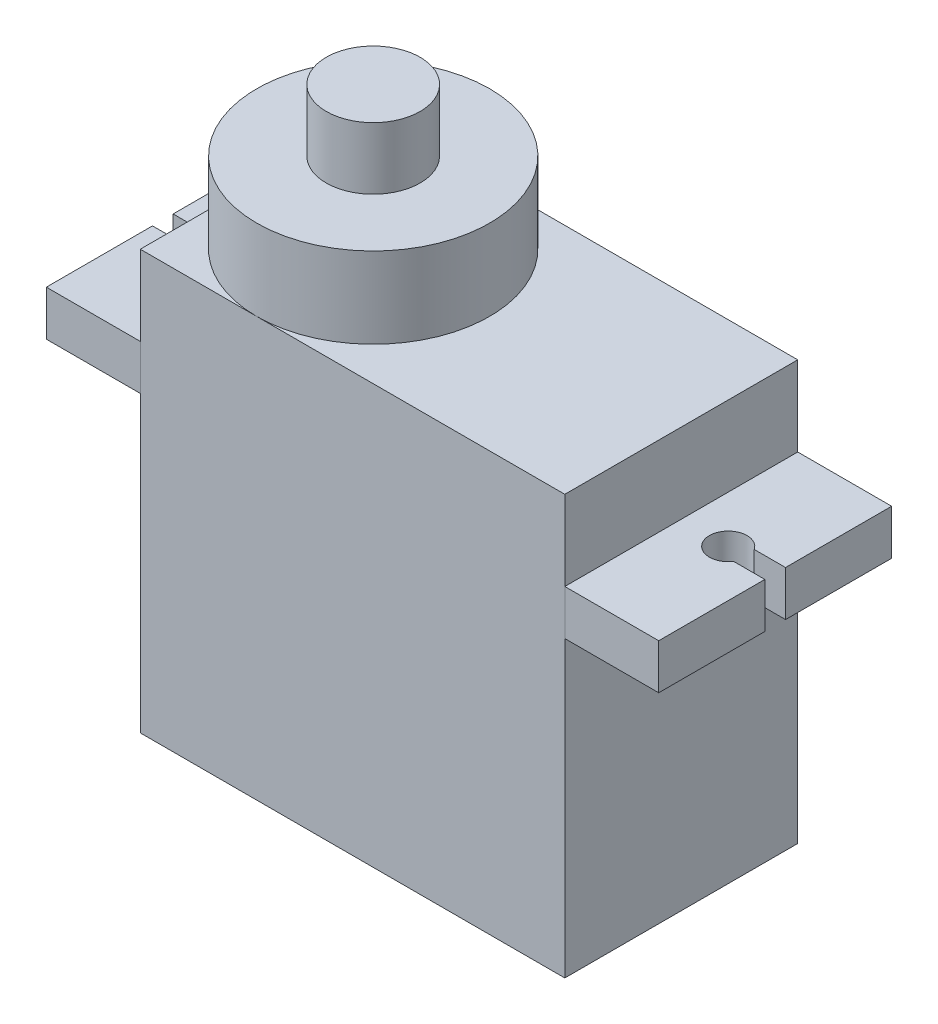
ISO-10303-21;
HEADER;
FILE_DESCRIPTION(('STEP AP214'),'2;1');
FILE_NAME('part.step','',(''),(''),'','','');
FILE_SCHEMA(('AUTOMOTIVE_DESIGN { 1 0 10303 214 1 1 1 1 }'));
ENDSEC;
DATA;
#1=APPLICATION_CONTEXT('core data for automotive mechanical design processes');
#2=APPLICATION_PROTOCOL_DEFINITION('international standard','automotive_design',2000,#1);
#3=PRODUCT_CONTEXT('',#1,'mechanical');
#4=PRODUCT('Part','Part','',(#3));
#5=PRODUCT_RELATED_PRODUCT_CATEGORY('part','',(#4));
#6=PRODUCT_DEFINITION_FORMATION('','',#4);
#7=PRODUCT_DEFINITION_CONTEXT('part definition',#1,'design');
#8=PRODUCT_DEFINITION('design','',#6,#7);
#9=PRODUCT_DEFINITION_SHAPE('','',#8);
#10=(LENGTH_UNIT() NAMED_UNIT(*) SI_UNIT(.MILLI.,.METRE.));
#11=(NAMED_UNIT(*) PLANE_ANGLE_UNIT() SI_UNIT($,.RADIAN.));
#12=(NAMED_UNIT(*) SI_UNIT($,.STERADIAN.) SOLID_ANGLE_UNIT());
#13=UNCERTAINTY_MEASURE_WITH_UNIT(LENGTH_MEASURE(1.E-05),#10,'distance_accuracy_value','');
#14=(GEOMETRIC_REPRESENTATION_CONTEXT(3) GLOBAL_UNCERTAINTY_ASSIGNED_CONTEXT((#13)) GLOBAL_UNIT_ASSIGNED_CONTEXT((#10,
#11,#12)) REPRESENTATION_CONTEXT('',''));
#15=CARTESIAN_POINT('',(0.,0.,0.));
#16=DIRECTION('',(0.,0.,1.));
#17=DIRECTION('',(1.,0.,0.));
#18=AXIS2_PLACEMENT_3D('',#15,#16,#17);
#19=CARTESIAN_POINT('',(-16.3,18.05,-6.2));
#20=DIRECTION('',(-1.,0.,0.));
#21=DIRECTION('',(0.,0.,1.));
#22=AXIS2_PLACEMENT_3D('',#19,#20,#21);
#23=PLANE('',#22);
#24=DIRECTION('',(0.,1.,0.));
#25=VECTOR('',#24,1.);
#26=CARTESIAN_POINT('',(-16.3,0.,0.550000000000012));
#27=LINE('',#26,#25);
#28=CARTESIAN_POINT('',(-16.3,15.65,0.550000000000012));
#29=VERTEX_POINT('',#28);
#30=CARTESIAN_POINT('',(-16.3,18.05,0.550000000000012));
#31=VERTEX_POINT('',#30);
#32=EDGE_CURVE('E149',#29,#31,#27,.T.);
#33=ORIENTED_EDGE('',*,*,#32,.F.);
#34=DIRECTION('',(0.,0.,1.));
#35=VECTOR('',#34,1.);
#36=CARTESIAN_POINT('',(-16.3,15.65,-6.2));
#37=LINE('',#36,#35);
#38=CARTESIAN_POINT('',(-16.3,15.65,6.2));
#39=VERTEX_POINT('',#38);
#40=EDGE_CURVE('E154',#29,#39,#37,.T.);
#41=ORIENTED_EDGE('',*,*,#40,.T.);
#42=DIRECTION('',(0.,-1.,0.));
#43=VECTOR('',#42,1.);
#44=CARTESIAN_POINT('',(-16.3,18.05,6.2));
#45=LINE('',#44,#43);
#46=CARTESIAN_POINT('',(-16.3,18.05,6.2));
#47=VERTEX_POINT('',#46);
#48=EDGE_CURVE('E162',#47,#39,#45,.T.);
#49=ORIENTED_EDGE('',*,*,#48,.F.);
#50=DIRECTION('',(0.,0.,1.));
#51=VECTOR('',#50,1.);
#52=CARTESIAN_POINT('',(-16.3,18.05,-6.2));
#53=LINE('',#52,#51);
#54=EDGE_CURVE('E155',#31,#47,#53,.T.);
#55=ORIENTED_EDGE('',*,*,#54,.F.);
#56=EDGE_LOOP('',(#33,#41,#49,#55));
#57=FACE_BOUND('',#56,.T.);
#58=ADVANCED_FACE('F61',(#57),#23,.T.);
#59=CARTESIAN_POINT('',(-11.3,18.05,-6.2));
#60=DIRECTION('',(1.,0.,0.));
#61=DIRECTION('',(0.,0.,-1.));
#62=AXIS2_PLACEMENT_3D('',#59,#60,#61);
#63=PLANE('',#62);
#64=DIRECTION('',(0.,1.,0.));
#65=VECTOR('',#64,1.);
#66=CARTESIAN_POINT('',(-11.3,18.05,6.2));
#67=LINE('',#66,#65);
#68=CARTESIAN_POINT('',(-11.3,15.65,6.2));
#69=VERTEX_POINT('',#68);
#70=CARTESIAN_POINT('',(-11.3,18.05,6.2));
#71=VERTEX_POINT('',#70);
#72=EDGE_CURVE('E168',#69,#71,#67,.T.);
#73=ORIENTED_EDGE('',*,*,#72,.F.);
#74=DIRECTION('',(0.,0.,1.));
#75=VECTOR('',#74,1.);
#76=CARTESIAN_POINT('',(-11.3,15.65,-6.2));
#77=LINE('',#76,#75);
#78=CARTESIAN_POINT('',(-11.3,15.65,-6.2));
#79=VERTEX_POINT('',#78);
#80=EDGE_CURVE('E12',#79,#69,#77,.T.);
#81=ORIENTED_EDGE('',*,*,#80,.F.);
#82=DIRECTION('',(0.,1.,0.));
#83=VECTOR('',#82,1.);
#84=CARTESIAN_POINT('',(-11.3,18.05,-6.2));
#85=LINE('',#84,#83);
#86=CARTESIAN_POINT('',(-11.3,18.05,-6.2));
#87=VERTEX_POINT('',#86);
#88=EDGE_CURVE('E161',#79,#87,#85,.T.);
#89=ORIENTED_EDGE('',*,*,#88,.T.);
#90=DIRECTION('',(0.,0.,1.));
#91=VECTOR('',#90,1.);
#92=CARTESIAN_POINT('',(-11.3,18.05,-6.2));
#93=LINE('',#92,#91);
#94=EDGE_CURVE('E65',#87,#71,#93,.T.);
#95=ORIENTED_EDGE('',*,*,#94,.T.);
#96=EDGE_LOOP('',(#73,#81,#89,#95));
#97=FACE_BOUND('',#96,.T.);
#98=ADVANCED_FACE('F63',(#97),#63,.T.);
#99=CARTESIAN_POINT('',(-11.3,15.65,-6.2));
#100=DIRECTION('',(0.,-1.,0.));
#101=DIRECTION('',(0.,0.,-1.));
#102=AXIS2_PLACEMENT_3D('',#99,#100,#101);
#103=PLANE('',#102);
#104=DIRECTION('',(-1.,0.,0.));
#105=VECTOR('',#104,1.);
#106=CARTESIAN_POINT('',(-11.3,15.65,0.55000000000001));
#107=LINE('',#106,#105);
#108=CARTESIAN_POINT('',(-14.6351646544245,15.65,0.550000000000011));
#109=VERTEX_POINT('',#108);
#110=EDGE_CURVE('E179',#109,#29,#107,.T.);
#111=ORIENTED_EDGE('',*,*,#110,.F.);
#112=CARTESIAN_POINT('',(-13.8,15.65,0.));
#113=DIRECTION('',(0.,-1.,0.));
#114=DIRECTION('',(0.,0.,-1.));
#115=AXIS2_PLACEMENT_3D('',#112,#113,#114);
#116=CIRCLE('',#115,1.);
#117=CARTESIAN_POINT('',(-14.6351646544245,15.65,-0.550000000000004));
#118=VERTEX_POINT('',#117);
#119=EDGE_CURVE('E171',#118,#109,#116,.T.);
#120=ORIENTED_EDGE('',*,*,#119,.F.);
#121=DIRECTION('',(1.,0.,0.));
#122=VECTOR('',#121,1.);
#123=CARTESIAN_POINT('',(-11.3,15.65,-0.550000000000004));
#124=LINE('',#123,#122);
#125=CARTESIAN_POINT('',(-16.3,15.65,-0.550000000000004));
#126=VERTEX_POINT('',#125);
#127=EDGE_CURVE('E181',#126,#118,#124,.T.);
#128=ORIENTED_EDGE('',*,*,#127,.F.);
#129=CARTESIAN_POINT('',(-16.3,15.65,-6.2));
#130=VERTEX_POINT('',#129);
#131=EDGE_CURVE('E70',#130,#126,#37,.T.);
#132=ORIENTED_EDGE('',*,*,#131,.F.);
#133=DIRECTION('',(1.,0.,0.));
#134=VECTOR('',#133,1.);
#135=CARTESIAN_POINT('',(-11.3,15.65,-6.2));
#136=LINE('',#135,#134);
#137=EDGE_CURVE('E172',#130,#79,#136,.T.);
#138=ORIENTED_EDGE('',*,*,#137,.T.);
#139=ORIENTED_EDGE('',*,*,#80,.T.);
#140=DIRECTION('',(1.,0.,0.));
#141=VECTOR('',#140,1.);
#142=CARTESIAN_POINT('',(-11.3,15.65,6.2));
#143=LINE('',#142,#141);
#144=EDGE_CURVE('E158',#39,#69,#143,.T.);
#145=ORIENTED_EDGE('',*,*,#144,.F.);
#146=ORIENTED_EDGE('',*,*,#40,.F.);
#147=EDGE_LOOP('',(#111,#120,#128,#132,#138,#139,#145,#146));
#148=FACE_BOUND('',#147,.T.);
#149=ADVANCED_FACE('F203',(#148),#103,.T.);
#150=DIRECTION('',(0.,1.,0.));
#151=VECTOR('',#150,1.);
#152=CARTESIAN_POINT('',(-16.3,0.,-0.550000000000004));
#153=LINE('',#152,#151);
#154=CARTESIAN_POINT('',(-16.3,18.05,-0.550000000000004));
#155=VERTEX_POINT('',#154);
#156=EDGE_CURVE('E137',#126,#155,#153,.T.);
#157=ORIENTED_EDGE('',*,*,#156,.T.);
#158=CARTESIAN_POINT('',(-16.3,18.05,-6.2));
#159=VERTEX_POINT('',#158);
#160=EDGE_CURVE('E147',#159,#155,#53,.T.);
#161=ORIENTED_EDGE('',*,*,#160,.F.);
#162=DIRECTION('',(0.,-1.,0.));
#163=VECTOR('',#162,1.);
#164=CARTESIAN_POINT('',(-16.3,18.05,-6.2));
#165=LINE('',#164,#163);
#166=EDGE_CURVE('E174',#159,#130,#165,.T.);
#167=ORIENTED_EDGE('',*,*,#166,.T.);
#168=ORIENTED_EDGE('',*,*,#131,.T.);
#169=EDGE_LOOP('',(#157,#161,#167,#168));
#170=FACE_BOUND('',#169,.T.);
#171=ADVANCED_FACE('F145',(#170),#23,.T.);
#172=CARTESIAN_POINT('',(-11.3,18.05,-6.2));
#173=DIRECTION('',(0.,1.,0.));
#174=DIRECTION('',(0.,0.,1.));
#175=AXIS2_PLACEMENT_3D('',#172,#173,#174);
#176=PLANE('',#175);
#177=DIRECTION('',(1.,0.,0.));
#178=VECTOR('',#177,1.);
#179=CARTESIAN_POINT('',(-14.6351646544245,18.05,0.550000000000011));
#180=LINE('',#179,#178);
#181=CARTESIAN_POINT('',(-14.6351646544245,18.05,0.550000000000011));
#182=VERTEX_POINT('',#181);
#183=EDGE_CURVE('E141',#31,#182,#180,.T.);
#184=ORIENTED_EDGE('',*,*,#183,.F.);
#185=ORIENTED_EDGE('',*,*,#54,.T.);
#186=DIRECTION('',(-1.,0.,0.));
#187=VECTOR('',#186,1.);
#188=CARTESIAN_POINT('',(-11.3,18.05,6.2));
#189=LINE('',#188,#187);
#190=EDGE_CURVE('E165',#71,#47,#189,.T.);
#191=ORIENTED_EDGE('',*,*,#190,.F.);
#192=ORIENTED_EDGE('',*,*,#94,.F.);
#193=DIRECTION('',(-1.,0.,0.));
#194=VECTOR('',#193,1.);
#195=CARTESIAN_POINT('',(-11.3,18.05,-6.2));
#196=LINE('',#195,#194);
#197=EDGE_CURVE('E153',#87,#159,#196,.T.);
#198=ORIENTED_EDGE('',*,*,#197,.T.);
#199=ORIENTED_EDGE('',*,*,#160,.T.);
#200=DIRECTION('',(-1.,0.,0.));
#201=VECTOR('',#200,1.);
#202=CARTESIAN_POINT('',(-16.3,18.05,-0.550000000000004));
#203=LINE('',#202,#201);
#204=CARTESIAN_POINT('',(-14.6351646544245,18.05,-0.550000000000004));
#205=VERTEX_POINT('',#204);
#206=EDGE_CURVE('E134',#205,#155,#203,.T.);
#207=ORIENTED_EDGE('',*,*,#206,.F.);
#208=CARTESIAN_POINT('',(-13.8,18.05,0.));
#209=DIRECTION('',(0.,1.,0.));
#210=DIRECTION('',(0.,0.,-1.));
#211=AXIS2_PLACEMENT_3D('',#208,#209,#210);
#212=CIRCLE('',#211,1.);
#213=EDGE_CURVE('E78',#182,#205,#212,.T.);
#214=ORIENTED_EDGE('',*,*,#213,.F.);
#215=EDGE_LOOP('',(#184,#185,#191,#192,#198,#199,#207,#214));
#216=FACE_BOUND('',#215,.T.);
#217=ADVANCED_FACE('F152',(#216),#176,.T.);
#218=CARTESIAN_POINT('',(0.,0.,-6.2));
#219=DIRECTION('',(0.,0.,-1.));
#220=DIRECTION('',(-1.,0.,0.));
#221=AXIS2_PLACEMENT_3D('',#218,#219,#220);
#222=PLANE('',#221);
#223=ORIENTED_EDGE('',*,*,#88,.F.);
#224=ORIENTED_EDGE('',*,*,#137,.F.);
#225=ORIENTED_EDGE('',*,*,#166,.F.);
#226=ORIENTED_EDGE('',*,*,#197,.F.);
#227=EDGE_LOOP('',(#223,#224,#225,#226));
#228=FACE_BOUND('',#227,.T.);
#229=ADVANCED_FACE('F202',(#228),#222,.T.);
#230=CARTESIAN_POINT('',(0.,0.,6.2));
#231=DIRECTION('',(0.,0.,-1.));
#232=DIRECTION('',(-1.,0.,0.));
#233=AXIS2_PLACEMENT_3D('',#230,#231,#232);
#234=PLANE('',#233);
#235=ORIENTED_EDGE('',*,*,#72,.T.);
#236=ORIENTED_EDGE('',*,*,#190,.T.);
#237=ORIENTED_EDGE('',*,*,#48,.T.);
#238=ORIENTED_EDGE('',*,*,#144,.T.);
#239=EDGE_LOOP('',(#235,#236,#237,#238));
#240=FACE_BOUND('',#239,.T.);
#241=ADVANCED_FACE('F199',(#240),#234,.F.);
#242=CARTESIAN_POINT('',(-13.8,0.,0.));
#243=DIRECTION('',(0.,1.,0.));
#244=DIRECTION('',(0.,0.,1.));
#245=AXIS2_PLACEMENT_3D('',#242,#243,#244);
#246=CYLINDRICAL_SURFACE('',#245,1.);
#247=ORIENTED_EDGE('',*,*,#119,.T.);
#248=DIRECTION('',(0.,1.,0.));
#249=VECTOR('',#248,1.);
#250=CARTESIAN_POINT('',(-14.6351646544245,0.,0.550000000000011));
#251=LINE('',#250,#249);
#252=EDGE_CURVE('E183',#109,#182,#251,.T.);
#253=ORIENTED_EDGE('',*,*,#252,.T.);
#254=ORIENTED_EDGE('',*,*,#213,.T.);
#255=DIRECTION('',(0.,1.,0.));
#256=VECTOR('',#255,1.);
#257=CARTESIAN_POINT('',(-14.6351646544245,0.,-0.550000000000004));
#258=LINE('',#257,#256);
#259=EDGE_CURVE('E139',#118,#205,#258,.T.);
#260=ORIENTED_EDGE('',*,*,#259,.F.);
#261=EDGE_LOOP('',(#247,#253,#254,#260));
#262=FACE_BOUND('',#261,.T.);
#263=ADVANCED_FACE('F205',(#262),#246,.F.);
#264=CARTESIAN_POINT('',(-14.6351646544245,0.,0.550000000000011));
#265=DIRECTION('',(0.,0.,1.));
#266=DIRECTION('',(1.,0.,0.));
#267=AXIS2_PLACEMENT_3D('',#264,#265,#266);
#268=PLANE('',#267);
#269=ORIENTED_EDGE('',*,*,#110,.T.);
#270=ORIENTED_EDGE('',*,*,#32,.T.);
#271=ORIENTED_EDGE('',*,*,#183,.T.);
#272=ORIENTED_EDGE('',*,*,#252,.F.);
#273=EDGE_LOOP('',(#269,#270,#271,#272));
#274=FACE_BOUND('',#273,.T.);
#275=ADVANCED_FACE('F191',(#274),#268,.F.);
#276=CARTESIAN_POINT('',(-16.3,0.,-0.550000000000004));
#277=DIRECTION('',(0.,0.,-1.));
#278=DIRECTION('',(-1.,0.,0.));
#279=AXIS2_PLACEMENT_3D('',#276,#277,#278);
#280=PLANE('',#279);
#281=ORIENTED_EDGE('',*,*,#127,.T.);
#282=ORIENTED_EDGE('',*,*,#259,.T.);
#283=ORIENTED_EDGE('',*,*,#206,.T.);
#284=ORIENTED_EDGE('',*,*,#156,.F.);
#285=EDGE_LOOP('',(#281,#282,#283,#284));
#286=FACE_BOUND('',#285,.T.);
#287=ADVANCED_FACE('F136',(#286),#280,.F.);
#288=CLOSED_SHELL('',(#58,#98,#149,#171,#217,#229,#241,#263,#275,#287));
#289=MANIFOLD_SOLID_BREP('B2',#288);
#290=CARTESIAN_POINT('',(16.3,18.05,-6.2));
#291=DIRECTION('',(1.,0.,0.));
#292=DIRECTION('',(0.,0.,-1.));
#293=AXIS2_PLACEMENT_3D('',#290,#291,#292);
#294=PLANE('',#293);
#295=DIRECTION('',(0.,1.,0.));
#296=VECTOR('',#295,1.);
#297=CARTESIAN_POINT('',(16.3,0.,-0.550000000000004));
#298=LINE('',#297,#296);
#299=CARTESIAN_POINT('',(16.3,15.65,-0.550000000000004));
#300=VERTEX_POINT('',#299);
#301=CARTESIAN_POINT('',(16.3,18.05,-0.550000000000004));
#302=VERTEX_POINT('',#301);
#303=EDGE_CURVE('E391',#300,#302,#298,.T.);
#304=ORIENTED_EDGE('',*,*,#303,.F.);
#305=DIRECTION('',(0.,0.,1.));
#306=VECTOR('',#305,1.);
#307=CARTESIAN_POINT('',(16.3,15.65,-6.2));
#308=LINE('',#307,#306);
#309=CARTESIAN_POINT('',(16.3,15.65,-6.2));
#310=VERTEX_POINT('',#309);
#311=EDGE_CURVE('E418',#310,#300,#308,.T.);
#312=ORIENTED_EDGE('',*,*,#311,.F.);
#313=DIRECTION('',(0.,1.,0.));
#314=VECTOR('',#313,1.);
#315=CARTESIAN_POINT('',(16.3,18.05,-6.2));
#316=LINE('',#315,#314);
#317=CARTESIAN_POINT('',(16.3,18.05,-6.2));
#318=VERTEX_POINT('',#317);
#319=EDGE_CURVE('E399',#310,#318,#316,.T.);
#320=ORIENTED_EDGE('',*,*,#319,.T.);
#321=DIRECTION('',(0.,0.,1.));
#322=VECTOR('',#321,1.);
#323=CARTESIAN_POINT('',(16.3,18.05,-6.2));
#324=LINE('',#323,#322);
#325=EDGE_CURVE('E415',#318,#302,#324,.T.);
#326=ORIENTED_EDGE('',*,*,#325,.T.);
#327=EDGE_LOOP('',(#304,#312,#320,#326));
#328=FACE_BOUND('',#327,.T.);
#329=ADVANCED_FACE('F294',(#328),#294,.T.);
#330=CARTESIAN_POINT('',(11.3,18.05,-6.2));
#331=DIRECTION('',(-1.,0.,0.));
#332=DIRECTION('',(0.,0.,1.));
#333=AXIS2_PLACEMENT_3D('',#330,#331,#332);
#334=PLANE('',#333);
#335=DIRECTION('',(0.,-1.,0.));
#336=VECTOR('',#335,1.);
#337=CARTESIAN_POINT('',(11.3,18.05,6.2));
#338=LINE('',#337,#336);
#339=CARTESIAN_POINT('',(11.3,18.05,6.2));
#340=VERTEX_POINT('',#339);
#341=CARTESIAN_POINT('',(11.3,15.65,6.2));
#342=VERTEX_POINT('',#341);
#343=EDGE_CURVE('E390',#340,#342,#338,.T.);
#344=ORIENTED_EDGE('',*,*,#343,.F.);
#345=DIRECTION('',(0.,0.,1.));
#346=VECTOR('',#345,1.);
#347=CARTESIAN_POINT('',(11.3,18.05,-6.2));
#348=LINE('',#347,#346);
#349=CARTESIAN_POINT('',(11.3,18.05,-6.2));
#350=VERTEX_POINT('',#349);
#351=EDGE_CURVE('E318',#350,#340,#348,.T.);
#352=ORIENTED_EDGE('',*,*,#351,.F.);
#353=DIRECTION('',(0.,-1.,0.));
#354=VECTOR('',#353,1.);
#355=CARTESIAN_POINT('',(11.3,18.05,-6.2));
#356=LINE('',#355,#354);
#357=CARTESIAN_POINT('',(11.3,15.65,-6.2));
#358=VERTEX_POINT('',#357);
#359=EDGE_CURVE('E394',#350,#358,#356,.T.);
#360=ORIENTED_EDGE('',*,*,#359,.T.);
#361=DIRECTION('',(0.,0.,1.));
#362=VECTOR('',#361,1.);
#363=CARTESIAN_POINT('',(11.3,15.65,-6.2));
#364=LINE('',#363,#362);
#365=EDGE_CURVE('E344',#358,#342,#364,.T.);
#366=ORIENTED_EDGE('',*,*,#365,.T.);
#367=EDGE_LOOP('',(#344,#352,#360,#366));
#368=FACE_BOUND('',#367,.T.);
#369=ADVANCED_FACE('F296',(#368),#334,.T.);
#370=CARTESIAN_POINT('',(11.3,18.05,-6.2));
#371=DIRECTION('',(0.,1.,0.));
#372=DIRECTION('',(0.,0.,1.));
#373=AXIS2_PLACEMENT_3D('',#370,#371,#372);
#374=PLANE('',#373);
#375=DIRECTION('',(-1.,0.,0.));
#376=VECTOR('',#375,1.);
#377=CARTESIAN_POINT('',(14.6351646544245,18.05,-0.550000000000004));
#378=LINE('',#377,#376);
#379=CARTESIAN_POINT('',(14.6351646544245,18.05,-0.550000000000004));
#380=VERTEX_POINT('',#379);
#381=EDGE_CURVE('E373',#302,#380,#378,.T.);
#382=ORIENTED_EDGE('',*,*,#381,.F.);
#383=ORIENTED_EDGE('',*,*,#325,.F.);
#384=DIRECTION('',(-1.,0.,0.));
#385=VECTOR('',#384,1.);
#386=CARTESIAN_POINT('',(11.3,18.05,-6.2));
#387=LINE('',#386,#385);
#388=EDGE_CURVE('E402',#318,#350,#387,.T.);
#389=ORIENTED_EDGE('',*,*,#388,.T.);
#390=ORIENTED_EDGE('',*,*,#351,.T.);
#391=DIRECTION('',(-1.,0.,0.));
#392=VECTOR('',#391,1.);
#393=CARTESIAN_POINT('',(11.3,18.05,6.2));
#394=LINE('',#393,#392);
#395=CARTESIAN_POINT('',(16.3,18.05,6.2));
#396=VERTEX_POINT('',#395);
#397=EDGE_CURVE('E397',#396,#340,#394,.T.);
#398=ORIENTED_EDGE('',*,*,#397,.F.);
#399=CARTESIAN_POINT('',(16.3,18.05,0.549999999999996));
#400=VERTEX_POINT('',#399);
#401=EDGE_CURVE('E385',#400,#396,#324,.T.);
#402=ORIENTED_EDGE('',*,*,#401,.F.);
#403=DIRECTION('',(1.,0.,0.));
#404=VECTOR('',#403,1.);
#405=CARTESIAN_POINT('',(16.3,18.05,0.549999999999996));
#406=LINE('',#405,#404);
#407=CARTESIAN_POINT('',(14.6351646544245,18.05,0.549999999999997));
#408=VERTEX_POINT('',#407);
#409=EDGE_CURVE('E369',#408,#400,#406,.T.);
#410=ORIENTED_EDGE('',*,*,#409,.F.);
#411=CARTESIAN_POINT('',(13.8,18.05,0.));
#412=DIRECTION('',(0.,1.,0.));
#413=DIRECTION('',(0.,0.,1.));
#414=AXIS2_PLACEMENT_3D('',#411,#412,#413);
#415=CIRCLE('',#414,1.);
#416=EDGE_CURVE('E376',#380,#408,#415,.T.);
#417=ORIENTED_EDGE('',*,*,#416,.F.);
#418=EDGE_LOOP('',(#382,#383,#389,#390,#398,#402,#410,#417));
#419=FACE_BOUND('',#418,.T.);
#420=ADVANCED_FACE('F384',(#419),#374,.T.);
#421=DIRECTION('',(0.,1.,0.));
#422=VECTOR('',#421,1.);
#423=CARTESIAN_POINT('',(16.3,0.,0.549999999999996));
#424=LINE('',#423,#422);
#425=CARTESIAN_POINT('',(16.3,15.65,0.549999999999994));
#426=VERTEX_POINT('',#425);
#427=EDGE_CURVE('E309',#426,#400,#424,.T.);
#428=ORIENTED_EDGE('',*,*,#427,.T.);
#429=ORIENTED_EDGE('',*,*,#401,.T.);
#430=DIRECTION('',(0.,1.,0.));
#431=VECTOR('',#430,1.);
#432=CARTESIAN_POINT('',(16.3,18.05,6.2));
#433=LINE('',#432,#431);
#434=CARTESIAN_POINT('',(16.3,15.65,6.2));
#435=VERTEX_POINT('',#434);
#436=EDGE_CURVE('E409',#435,#396,#433,.T.);
#437=ORIENTED_EDGE('',*,*,#436,.F.);
#438=EDGE_CURVE('E421',#426,#435,#308,.T.);
#439=ORIENTED_EDGE('',*,*,#438,.F.);
#440=EDGE_LOOP('',(#428,#429,#437,#439));
#441=FACE_BOUND('',#440,.T.);
#442=ADVANCED_FACE('F438',(#441),#294,.T.);
#443=CARTESIAN_POINT('',(11.3,15.65,-6.2));
#444=DIRECTION('',(0.,-1.,0.));
#445=DIRECTION('',(0.,0.,-1.));
#446=AXIS2_PLACEMENT_3D('',#443,#444,#445);
#447=PLANE('',#446);
#448=DIRECTION('',(1.,0.,0.));
#449=VECTOR('',#448,1.);
#450=CARTESIAN_POINT('',(11.3,15.65,-0.550000000000004));
#451=LINE('',#450,#449);
#452=CARTESIAN_POINT('',(14.6351646544245,15.65,-0.550000000000004));
#453=VERTEX_POINT('',#452);
#454=EDGE_CURVE('E59',#453,#300,#451,.T.);
#455=ORIENTED_EDGE('',*,*,#454,.F.);
#456=CARTESIAN_POINT('',(13.8,15.65,0.));
#457=DIRECTION('',(0.,-1.,0.));
#458=DIRECTION('',(0.,0.,-1.));
#459=AXIS2_PLACEMENT_3D('',#456,#457,#458);
#460=CIRCLE('',#459,1.);
#461=CARTESIAN_POINT('',(14.6351646544245,15.65,0.549999999999997));
#462=VERTEX_POINT('',#461);
#463=EDGE_CURVE('E302',#462,#453,#460,.T.);
#464=ORIENTED_EDGE('',*,*,#463,.F.);
#465=DIRECTION('',(-1.,0.,0.));
#466=VECTOR('',#465,1.);
#467=CARTESIAN_POINT('',(11.3,15.65,0.549999999999998));
#468=LINE('',#467,#466);
#469=EDGE_CURVE('E370',#426,#462,#468,.T.);
#470=ORIENTED_EDGE('',*,*,#469,.F.);
#471=ORIENTED_EDGE('',*,*,#438,.T.);
#472=DIRECTION('',(1.,0.,0.));
#473=VECTOR('',#472,1.);
#474=CARTESIAN_POINT('',(11.3,15.65,6.2));
#475=LINE('',#474,#473);
#476=EDGE_CURVE('E406',#342,#435,#475,.T.);
#477=ORIENTED_EDGE('',*,*,#476,.F.);
#478=ORIENTED_EDGE('',*,*,#365,.F.);
#479=DIRECTION('',(1.,0.,0.));
#480=VECTOR('',#479,1.);
#481=CARTESIAN_POINT('',(11.3,15.65,-6.2));
#482=LINE('',#481,#480);
#483=EDGE_CURVE('E396',#358,#310,#482,.T.);
#484=ORIENTED_EDGE('',*,*,#483,.T.);
#485=ORIENTED_EDGE('',*,*,#311,.T.);
#486=EDGE_LOOP('',(#455,#464,#470,#471,#477,#478,#484,#485));
#487=FACE_BOUND('',#486,.T.);
#488=ADVANCED_FACE('F427',(#487),#447,.T.);
#489=CARTESIAN_POINT('',(0.,0.,-6.2));
#490=DIRECTION('',(0.,0.,1.));
#491=DIRECTION('',(1.,0.,0.));
#492=AXIS2_PLACEMENT_3D('',#489,#490,#491);
#493=PLANE('',#492);
#494=ORIENTED_EDGE('',*,*,#359,.F.);
#495=ORIENTED_EDGE('',*,*,#388,.F.);
#496=ORIENTED_EDGE('',*,*,#319,.F.);
#497=ORIENTED_EDGE('',*,*,#483,.F.);
#498=EDGE_LOOP('',(#494,#495,#496,#497));
#499=FACE_BOUND('',#498,.T.);
#500=ADVANCED_FACE('F432',(#499),#493,.F.);
#501=CARTESIAN_POINT('',(0.,0.,6.2));
#502=DIRECTION('',(0.,0.,1.));
#503=DIRECTION('',(1.,0.,0.));
#504=AXIS2_PLACEMENT_3D('',#501,#502,#503);
#505=PLANE('',#504);
#506=ORIENTED_EDGE('',*,*,#343,.T.);
#507=ORIENTED_EDGE('',*,*,#476,.T.);
#508=ORIENTED_EDGE('',*,*,#436,.T.);
#509=ORIENTED_EDGE('',*,*,#397,.T.);
#510=EDGE_LOOP('',(#506,#507,#508,#509));
#511=FACE_BOUND('',#510,.T.);
#512=ADVANCED_FACE('F436',(#511),#505,.T.);
#513=CARTESIAN_POINT('',(13.8,0.,0.));
#514=DIRECTION('',(0.,1.,0.));
#515=DIRECTION('',(0.,0.,1.));
#516=AXIS2_PLACEMENT_3D('',#513,#514,#515);
#517=CYLINDRICAL_SURFACE('',#516,1.);
#518=ORIENTED_EDGE('',*,*,#463,.T.);
#519=DIRECTION('',(0.,1.,0.));
#520=VECTOR('',#519,1.);
#521=CARTESIAN_POINT('',(14.6351646544245,0.,-0.550000000000004));
#522=LINE('',#521,#520);
#523=EDGE_CURVE('E379',#453,#380,#522,.T.);
#524=ORIENTED_EDGE('',*,*,#523,.T.);
#525=ORIENTED_EDGE('',*,*,#416,.T.);
#526=DIRECTION('',(0.,1.,0.));
#527=VECTOR('',#526,1.);
#528=CARTESIAN_POINT('',(14.6351646544245,0.,0.549999999999997));
#529=LINE('',#528,#527);
#530=EDGE_CURVE('E365',#462,#408,#529,.T.);
#531=ORIENTED_EDGE('',*,*,#530,.F.);
#532=EDGE_LOOP('',(#518,#524,#525,#531));
#533=FACE_BOUND('',#532,.T.);
#534=ADVANCED_FACE('F377',(#533),#517,.F.);
#535=CARTESIAN_POINT('',(14.6351646544245,0.,-0.550000000000004));
#536=DIRECTION('',(0.,0.,-1.));
#537=DIRECTION('',(-1.,0.,0.));
#538=AXIS2_PLACEMENT_3D('',#535,#536,#537);
#539=PLANE('',#538);
#540=ORIENTED_EDGE('',*,*,#454,.T.);
#541=ORIENTED_EDGE('',*,*,#303,.T.);
#542=ORIENTED_EDGE('',*,*,#381,.T.);
#543=ORIENTED_EDGE('',*,*,#523,.F.);
#544=EDGE_LOOP('',(#540,#541,#542,#543));
#545=FACE_BOUND('',#544,.T.);
#546=ADVANCED_FACE('F425',(#545),#539,.F.);
#547=CARTESIAN_POINT('',(16.3,0.,0.549999999999996));
#548=DIRECTION('',(0.,0.,1.));
#549=DIRECTION('',(1.,0.,0.));
#550=AXIS2_PLACEMENT_3D('',#547,#548,#549);
#551=PLANE('',#550);
#552=ORIENTED_EDGE('',*,*,#469,.T.);
#553=ORIENTED_EDGE('',*,*,#530,.T.);
#554=ORIENTED_EDGE('',*,*,#409,.T.);
#555=ORIENTED_EDGE('',*,*,#427,.F.);
#556=EDGE_LOOP('',(#552,#553,#554,#555));
#557=FACE_BOUND('',#556,.T.);
#558=ADVANCED_FACE('F367',(#557),#551,.F.);
#559=CLOSED_SHELL('',(#329,#369,#420,#442,#488,#500,#512,#534,#546,#558));
#560=MANIFOLD_SOLID_BREP('B6',#559);
#561=CARTESIAN_POINT('',(0.,22.3,0.));
#562=DIRECTION('',(0.,1.,0.));
#563=DIRECTION('',(0.,0.,1.));
#564=AXIS2_PLACEMENT_3D('',#561,#562,#563);
#565=PLANE('',#564);
#566=CARTESIAN_POINT('',(-5.1,22.3,0.));
#567=DIRECTION('',(0.,1.,0.));
#568=DIRECTION('',(0.,0.,1.));
#569=AXIS2_PLACEMENT_3D('',#566,#567,#568);
#570=CIRCLE('',#569,6.2);
#571=CARTESIAN_POINT('',(-5.1,22.3,6.2));
#572=VERTEX_POINT('',#571);
#573=CARTESIAN_POINT('',(-5.1,22.3,-6.2));
#574=VERTEX_POINT('',#573);
#575=EDGE_CURVE('E591',#572,#574,#570,.T.);
#576=ORIENTED_EDGE('',*,*,#575,.F.);
#577=DIRECTION('',(1.,0.,0.));
#578=VECTOR('',#577,1.);
#579=CARTESIAN_POINT('',(-11.3,22.3,6.2));
#580=LINE('',#579,#578);
#581=CARTESIAN_POINT('',(11.3,22.3,6.2));
#582=VERTEX_POINT('',#581);
#583=EDGE_CURVE('E578',#572,#582,#580,.T.);
#584=ORIENTED_EDGE('',*,*,#583,.T.);
#585=DIRECTION('',(0.,0.,-1.));
#586=VECTOR('',#585,1.);
#587=CARTESIAN_POINT('',(11.3,22.3,-6.2));
#588=LINE('',#587,#586);
#589=CARTESIAN_POINT('',(11.3,22.3,-6.2));
#590=VERTEX_POINT('',#589);
#591=EDGE_CURVE('E606',#582,#590,#588,.T.);
#592=ORIENTED_EDGE('',*,*,#591,.T.);
#593=DIRECTION('',(-1.,0.,0.));
#594=VECTOR('',#593,1.);
#595=CARTESIAN_POINT('',(-11.3,22.3,-6.2));
#596=LINE('',#595,#594);
#597=EDGE_CURVE('E592',#590,#574,#596,.T.);
#598=ORIENTED_EDGE('',*,*,#597,.T.);
#599=EDGE_LOOP('',(#576,#584,#592,#598));
#600=FACE_BOUND('',#599,.T.);
#601=ADVANCED_FACE('F518',(#600),#565,.T.);
#602=CARTESIAN_POINT('',(-11.3,22.3,0.));
#603=VERTEX_POINT('',#602);
#604=EDGE_CURVE('E528',#574,#603,#570,.T.);
#605=ORIENTED_EDGE('',*,*,#604,.F.);
#606=CARTESIAN_POINT('',(-11.3,22.3,-6.2));
#607=VERTEX_POINT('',#606);
#608=EDGE_CURVE('E609',#574,#607,#596,.T.);
#609=ORIENTED_EDGE('',*,*,#608,.T.);
#610=DIRECTION('',(0.,0.,1.));
#611=VECTOR('',#610,1.);
#612=CARTESIAN_POINT('',(-11.3,22.3,-6.2));
#613=LINE('',#612,#611);
#614=EDGE_CURVE('E588',#607,#603,#613,.T.);
#615=ORIENTED_EDGE('',*,*,#614,.T.);
#616=EDGE_LOOP('',(#605,#609,#615));
#617=FACE_BOUND('',#616,.T.);
#618=ADVANCED_FACE('F678',(#617),#565,.T.);
#619=CARTESIAN_POINT('',(11.3,22.3,-6.2));
#620=DIRECTION('',(-1.,0.,0.));
#621=DIRECTION('',(0.,0.,1.));
#622=AXIS2_PLACEMENT_3D('',#619,#620,#621);
#623=PLANE('',#622);
#624=DIRECTION('',(0.,0.,-1.));
#625=VECTOR('',#624,1.);
#626=CARTESIAN_POINT('',(11.3,0.,-6.2));
#627=LINE('',#626,#625);
#628=CARTESIAN_POINT('',(11.3,0.,6.2));
#629=VERTEX_POINT('',#628);
#630=CARTESIAN_POINT('',(11.3,0.,-6.2));
#631=VERTEX_POINT('',#630);
#632=EDGE_CURVE('E615',#629,#631,#627,.T.);
#633=ORIENTED_EDGE('',*,*,#632,.T.);
#634=DIRECTION('',(0.,-1.,0.));
#635=VECTOR('',#634,1.);
#636=CARTESIAN_POINT('',(11.3,22.3,-6.2));
#637=LINE('',#636,#635);
#638=EDGE_CURVE('E522',#590,#631,#637,.T.);
#639=ORIENTED_EDGE('',*,*,#638,.F.);
#640=ORIENTED_EDGE('',*,*,#591,.F.);
#641=DIRECTION('',(0.,-1.,0.));
#642=VECTOR('',#641,1.);
#643=CARTESIAN_POINT('',(11.3,22.3,6.2));
#644=LINE('',#643,#642);
#645=EDGE_CURVE('E577',#582,#629,#644,.T.);
#646=ORIENTED_EDGE('',*,*,#645,.T.);
#647=EDGE_LOOP('',(#633,#639,#640,#646));
#648=FACE_BOUND('',#647,.T.);
#649=ADVANCED_FACE('F520',(#648),#623,.F.);
#650=CARTESIAN_POINT('',(-11.3,22.3,-6.2));
#651=DIRECTION('',(0.,0.,1.));
#652=DIRECTION('',(1.,0.,0.));
#653=AXIS2_PLACEMENT_3D('',#650,#651,#652);
#654=PLANE('',#653);
#655=DIRECTION('',(-1.,0.,0.));
#656=VECTOR('',#655,1.);
#657=CARTESIAN_POINT('',(-11.3,0.,-6.2));
#658=LINE('',#657,#656);
#659=CARTESIAN_POINT('',(-11.3,0.,-6.2));
#660=VERTEX_POINT('',#659);
#661=EDGE_CURVE('E619',#631,#660,#658,.T.);
#662=ORIENTED_EDGE('',*,*,#661,.T.);
#663=DIRECTION('',(0.,-1.,0.));
#664=VECTOR('',#663,1.);
#665=CARTESIAN_POINT('',(-11.3,22.3,-6.2));
#666=LINE('',#665,#664);
#667=EDGE_CURVE('E603',#607,#660,#666,.T.);
#668=ORIENTED_EDGE('',*,*,#667,.F.);
#669=ORIENTED_EDGE('',*,*,#608,.F.);
#670=ORIENTED_EDGE('',*,*,#597,.F.);
#671=ORIENTED_EDGE('',*,*,#638,.T.);
#672=EDGE_LOOP('',(#662,#668,#669,#670,#671));
#673=FACE_BOUND('',#672,.T.);
#674=ADVANCED_FACE('F645',(#673),#654,.F.);
#675=CARTESIAN_POINT('',(-11.3,22.3,-6.2));
#676=DIRECTION('',(1.,0.,0.));
#677=DIRECTION('',(0.,0.,-1.));
#678=AXIS2_PLACEMENT_3D('',#675,#676,#677);
#679=PLANE('',#678);
#680=DIRECTION('',(0.,0.,1.));
#681=VECTOR('',#680,1.);
#682=CARTESIAN_POINT('',(-11.3,0.,-6.2));
#683=LINE('',#682,#681);
#684=CARTESIAN_POINT('',(-11.3,0.,6.2));
#685=VERTEX_POINT('',#684);
#686=EDGE_CURVE('E622',#660,#685,#683,.T.);
#687=ORIENTED_EDGE('',*,*,#686,.T.);
#688=DIRECTION('',(0.,-1.,0.));
#689=VECTOR('',#688,1.);
#690=CARTESIAN_POINT('',(-11.3,22.3,6.2));
#691=LINE('',#690,#689);
#692=CARTESIAN_POINT('',(-11.3,22.3,6.2));
#693=VERTEX_POINT('',#692);
#694=EDGE_CURVE('E629',#693,#685,#691,.T.);
#695=ORIENTED_EDGE('',*,*,#694,.F.);
#696=EDGE_CURVE('E572',#603,#693,#613,.T.);
#697=ORIENTED_EDGE('',*,*,#696,.F.);
#698=ORIENTED_EDGE('',*,*,#614,.F.);
#699=ORIENTED_EDGE('',*,*,#667,.T.);
#700=EDGE_LOOP('',(#687,#695,#697,#698,#699));
#701=FACE_BOUND('',#700,.T.);
#702=ADVANCED_FACE('F637',(#701),#679,.F.);
#703=CARTESIAN_POINT('',(-11.3,22.3,6.2));
#704=DIRECTION('',(0.,0.,-1.));
#705=DIRECTION('',(-1.,0.,0.));
#706=AXIS2_PLACEMENT_3D('',#703,#704,#705);
#707=PLANE('',#706);
#708=DIRECTION('',(1.,0.,0.));
#709=VECTOR('',#708,1.);
#710=CARTESIAN_POINT('',(-11.3,0.,6.2));
#711=LINE('',#710,#709);
#712=EDGE_CURVE('E610',#685,#629,#711,.T.);
#713=ORIENTED_EDGE('',*,*,#712,.T.);
#714=ORIENTED_EDGE('',*,*,#645,.F.);
#715=ORIENTED_EDGE('',*,*,#583,.F.);
#716=EDGE_CURVE('E569',#693,#572,#580,.T.);
#717=ORIENTED_EDGE('',*,*,#716,.F.);
#718=ORIENTED_EDGE('',*,*,#694,.T.);
#719=EDGE_LOOP('',(#713,#714,#715,#717,#718));
#720=FACE_BOUND('',#719,.T.);
#721=ADVANCED_FACE('F582',(#720),#707,.F.);
#722=EDGE_CURVE('E536',#603,#572,#570,.T.);
#723=ORIENTED_EDGE('',*,*,#722,.F.);
#724=ORIENTED_EDGE('',*,*,#696,.T.);
#725=ORIENTED_EDGE('',*,*,#716,.T.);
#726=EDGE_LOOP('',(#723,#724,#725));
#727=FACE_BOUND('',#726,.T.);
#728=ADVANCED_FACE('F571',(#727),#565,.T.);
#729=CARTESIAN_POINT('',(0.,0.,0.));
#730=DIRECTION('',(0.,1.,0.));
#731=DIRECTION('',(0.,0.,1.));
#732=AXIS2_PLACEMENT_3D('',#729,#730,#731);
#733=PLANE('',#732);
#734=ORIENTED_EDGE('',*,*,#632,.F.);
#735=ORIENTED_EDGE('',*,*,#712,.F.);
#736=ORIENTED_EDGE('',*,*,#686,.F.);
#737=ORIENTED_EDGE('',*,*,#661,.F.);
#738=EDGE_LOOP('',(#734,#735,#736,#737));
#739=FACE_BOUND('',#738,.T.);
#740=ADVANCED_FACE('F642',(#739),#733,.F.);
#741=CARTESIAN_POINT('',(-5.1,26.6,0.));
#742=DIRECTION('',(0.,-1.,0.));
#743=DIRECTION('',(0.,0.,-1.));
#744=AXIS2_PLACEMENT_3D('',#741,#742,#743);
#745=CYLINDRICAL_SURFACE('',#744,6.2);
#746=CARTESIAN_POINT('',(-5.1,26.6,0.));
#747=DIRECTION('',(0.,1.,0.));
#748=DIRECTION('',(0.,0.,1.));
#749=AXIS2_PLACEMENT_3D('',#746,#747,#748);
#750=CIRCLE('',#749,6.2);
#751=CARTESIAN_POINT('',(-5.1,26.6,6.2));
#752=VERTEX_POINT('',#751);
#753=EDGE_CURVE('E595',#752,#752,#750,.T.);
#754=ORIENTED_EDGE('',*,*,#753,.F.);
#755=EDGE_LOOP('',(#754));
#756=FACE_BOUND('',#755,.T.);
#757=ORIENTED_EDGE('',*,*,#575,.T.);
#758=ORIENTED_EDGE('',*,*,#604,.T.);
#759=ORIENTED_EDGE('',*,*,#722,.T.);
#760=EDGE_LOOP('',(#757,#758,#759));
#761=FACE_BOUND('',#760,.T.);
#762=ADVANCED_FACE('F598',(#756,#761),#745,.T.);
#763=CARTESIAN_POINT('',(-5.1,26.6,0.));
#764=DIRECTION('',(0.,1.,0.));
#765=DIRECTION('',(0.,0.,1.));
#766=AXIS2_PLACEMENT_3D('',#763,#764,#765);
#767=PLANE('',#766);
#768=CARTESIAN_POINT('',(-5.1,26.6,0.));
#769=DIRECTION('',(0.,1.,0.));
#770=DIRECTION('',(0.,0.,1.));
#771=AXIS2_PLACEMENT_3D('',#768,#769,#770);
#772=CIRCLE('',#771,2.5);
#773=CARTESIAN_POINT('',(-5.1,26.6,2.5));
#774=VERTEX_POINT('',#773);
#775=EDGE_CURVE('E292',#774,#774,#772,.T.);
#776=ORIENTED_EDGE('',*,*,#775,.F.);
#777=EDGE_LOOP('',(#776));
#778=FACE_BOUND('',#777,.T.);
#779=ORIENTED_EDGE('',*,*,#753,.T.);
#780=EDGE_LOOP('',(#779));
#781=FACE_BOUND('',#780,.T.);
#782=ADVANCED_FACE('F660',(#778,#781),#767,.T.);
#783=CARTESIAN_POINT('',(-5.1,29.9,0.));
#784=DIRECTION('',(0.,-1.,0.));
#785=DIRECTION('',(0.,0.,-1.));
#786=AXIS2_PLACEMENT_3D('',#783,#784,#785);
#787=CYLINDRICAL_SURFACE('',#786,2.5);
#788=CARTESIAN_POINT('',(-5.1,29.9,0.));
#789=DIRECTION('',(0.,1.,0.));
#790=DIRECTION('',(0.,0.,1.));
#791=AXIS2_PLACEMENT_3D('',#788,#789,#790);
#792=CIRCLE('',#791,2.5);
#793=CARTESIAN_POINT('',(-5.1,29.9,2.5));
#794=VERTEX_POINT('',#793);
#795=EDGE_CURVE('E596',#794,#794,#792,.T.);
#796=ORIENTED_EDGE('',*,*,#795,.F.);
#797=EDGE_LOOP('',(#796));
#798=FACE_BOUND('',#797,.T.);
#799=ORIENTED_EDGE('',*,*,#775,.T.);
#800=EDGE_LOOP('',(#799));
#801=FACE_BOUND('',#800,.T.);
#802=ADVANCED_FACE('F657',(#798,#801),#787,.T.);
#803=CARTESIAN_POINT('',(-5.1,29.9,0.));
#804=DIRECTION('',(0.,1.,0.));
#805=DIRECTION('',(0.,0.,1.));
#806=AXIS2_PLACEMENT_3D('',#803,#804,#805);
#807=PLANE('',#806);
#808=ORIENTED_EDGE('',*,*,#795,.T.);
#809=EDGE_LOOP('',(#808));
#810=FACE_BOUND('',#809,.T.);
#811=ADVANCED_FACE('F655',(#810),#807,.T.);
#812=CLOSED_SHELL('',(#601,#618,#649,#674,#702,#721,#728,#740,#762,#782,#802,#811));
#813=MANIFOLD_SOLID_BREP('B53',#812);
#814=ADVANCED_BREP_SHAPE_REPRESENTATION('',(#18,#289,#560,#813),#14);
#815=SHAPE_DEFINITION_REPRESENTATION(#9,#814);
ENDSEC;
END-ISO-10303-21;
